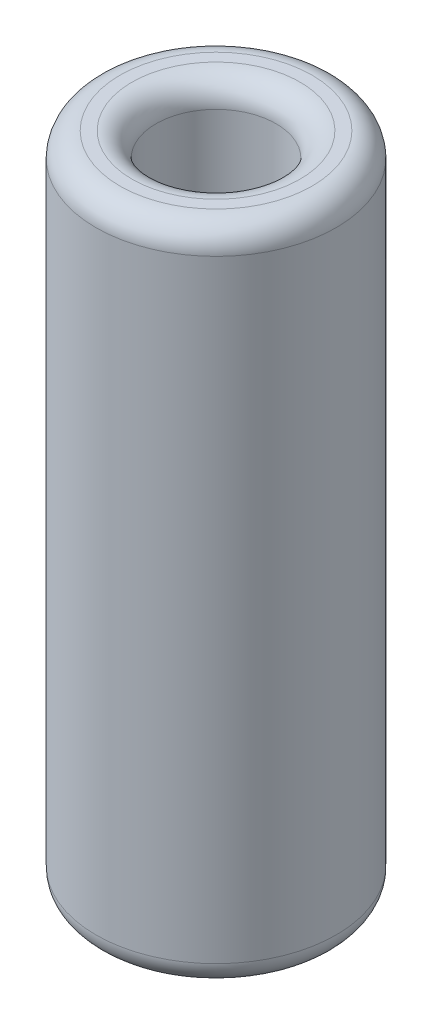
ISO-10303-21;
HEADER;
FILE_DESCRIPTION(('STEP AP214'),'2;1');
FILE_NAME('part.step','',(''),(''),'','','');
FILE_SCHEMA(('AUTOMOTIVE_DESIGN { 1 0 10303 214 1 1 1 1 }'));
ENDSEC;
DATA;
#1=APPLICATION_CONTEXT('core data for automotive mechanical design processes');
#2=APPLICATION_PROTOCOL_DEFINITION('international standard','automotive_design',2000,#1);
#3=PRODUCT_CONTEXT('',#1,'mechanical');
#4=PRODUCT('Part','Part','',(#3));
#5=PRODUCT_RELATED_PRODUCT_CATEGORY('part','',(#4));
#6=PRODUCT_DEFINITION_FORMATION('','',#4);
#7=PRODUCT_DEFINITION_CONTEXT('part definition',#1,'design');
#8=PRODUCT_DEFINITION('design','',#6,#7);
#9=PRODUCT_DEFINITION_SHAPE('','',#8);
#10=(LENGTH_UNIT() NAMED_UNIT(*) SI_UNIT(.MILLI.,.METRE.));
#11=(NAMED_UNIT(*) PLANE_ANGLE_UNIT() SI_UNIT($,.RADIAN.));
#12=(NAMED_UNIT(*) SI_UNIT($,.STERADIAN.) SOLID_ANGLE_UNIT());
#13=UNCERTAINTY_MEASURE_WITH_UNIT(LENGTH_MEASURE(1.E-05),#10,'distance_accuracy_value','');
#14=(GEOMETRIC_REPRESENTATION_CONTEXT(3) GLOBAL_UNCERTAINTY_ASSIGNED_CONTEXT((#13)) GLOBAL_UNIT_ASSIGNED_CONTEXT((#10,
#11,#12)) REPRESENTATION_CONTEXT('',''));
#15=CARTESIAN_POINT('',(0.,0.,0.));
#16=DIRECTION('',(0.,0.,1.));
#17=DIRECTION('',(1.,0.,0.));
#18=AXIS2_PLACEMENT_3D('',#15,#16,#17);
#19=CARTESIAN_POINT('',(0.,34.925,0.));
#20=DIRECTION('',(0.,1.,0.));
#21=DIRECTION('',(0.,0.,1.));
#22=AXIS2_PLACEMENT_3D('',#19,#20,#21);
#23=PLANE('',#22);
#24=CARTESIAN_POINT('',(0.,34.925,0.));
#25=DIRECTION('',(0.,1.,0.));
#26=DIRECTION('',(0.,0.,1.));
#27=AXIS2_PLACEMENT_3D('',#24,#25,#26);
#28=CIRCLE('',#27,8.89);
#29=CARTESIAN_POINT('',(0.,34.925,8.89));
#30=VERTEX_POINT('',#29);
#31=EDGE_CURVE('E10',#30,#30,#28,.F.);
#32=ORIENTED_EDGE('',*,*,#31,.T.);
#33=EDGE_LOOP('',(#32));
#34=FACE_BOUND('',#33,.T.);
#35=CARTESIAN_POINT('',(0.,34.925,0.));
#36=DIRECTION('',(0.,1.,0.));
#37=DIRECTION('',(0.,0.,1.));
#38=AXIS2_PLACEMENT_3D('',#35,#36,#37);
#39=CIRCLE('',#38,10.16);
#40=CARTESIAN_POINT('',(0.,34.925,10.16));
#41=VERTEX_POINT('',#40);
#42=EDGE_CURVE('E38',#41,#41,#39,.T.);
#43=ORIENTED_EDGE('',*,*,#42,.T.);
#44=EDGE_LOOP('',(#43));
#45=FACE_BOUND('',#44,.T.);
#46=ADVANCED_FACE('F31',(#34,#45),#23,.T.);
#47=CARTESIAN_POINT('',(0.,-34.925,0.));
#48=DIRECTION('',(0.,1.,0.));
#49=DIRECTION('',(0.,0.,1.));
#50=AXIS2_PLACEMENT_3D('',#47,#48,#49);
#51=PLANE('',#50);
#52=CARTESIAN_POINT('',(0.,-34.925,0.));
#53=DIRECTION('',(0.,1.,0.));
#54=DIRECTION('',(0.,0.,1.));
#55=AXIS2_PLACEMENT_3D('',#52,#53,#54);
#56=CIRCLE('',#55,8.89);
#57=CARTESIAN_POINT('',(0.,-34.925,8.89));
#58=VERTEX_POINT('',#57);
#59=EDGE_CURVE('E57',#58,#58,#56,.T.);
#60=ORIENTED_EDGE('',*,*,#59,.T.);
#61=EDGE_LOOP('',(#60));
#62=FACE_BOUND('',#61,.T.);
#63=CARTESIAN_POINT('',(0.,-34.925,0.));
#64=DIRECTION('',(0.,1.,0.));
#65=DIRECTION('',(0.,0.,1.));
#66=AXIS2_PLACEMENT_3D('',#63,#64,#65);
#67=CIRCLE('',#66,10.16);
#68=CARTESIAN_POINT('',(0.,-34.925,10.16));
#69=VERTEX_POINT('',#68);
#70=EDGE_CURVE('E60',#69,#69,#67,.F.);
#71=ORIENTED_EDGE('',*,*,#70,.T.);
#72=EDGE_LOOP('',(#71));
#73=FACE_BOUND('',#72,.T.);
#74=ADVANCED_FACE('F64',(#62,#73),#51,.F.);
#75=CARTESIAN_POINT('',(0.,34.925,0.));
#76=DIRECTION('',(0.,-1.,0.));
#77=DIRECTION('',(0.,0.,-1.));
#78=AXIS2_PLACEMENT_3D('',#75,#76,#77);
#79=CYLINDRICAL_SURFACE('',#78,12.7);
#80=CARTESIAN_POINT('',(0.,-32.385,0.));
#81=DIRECTION('',(0.,1.,0.));
#82=DIRECTION('',(0.,0.,1.));
#83=AXIS2_PLACEMENT_3D('',#80,#81,#82);
#84=CIRCLE('',#83,12.7);
#85=CARTESIAN_POINT('',(0.,-32.385,12.7));
#86=VERTEX_POINT('',#85);
#87=EDGE_CURVE('E42',#86,#86,#84,.T.);
#88=ORIENTED_EDGE('',*,*,#87,.T.);
#89=EDGE_LOOP('',(#88));
#90=FACE_BOUND('',#89,.T.);
#91=CARTESIAN_POINT('',(0.,32.385,0.));
#92=DIRECTION('',(0.,1.,0.));
#93=DIRECTION('',(0.,0.,1.));
#94=AXIS2_PLACEMENT_3D('',#91,#92,#93);
#95=CIRCLE('',#94,12.7);
#96=CARTESIAN_POINT('',(0.,32.385,12.7));
#97=VERTEX_POINT('',#96);
#98=EDGE_CURVE('E46',#97,#97,#95,.F.);
#99=ORIENTED_EDGE('',*,*,#98,.T.);
#100=EDGE_LOOP('',(#99));
#101=FACE_BOUND('',#100,.T.);
#102=ADVANCED_FACE('F74',(#90,#101),#79,.T.);
#103=CARTESIAN_POINT('',(0.,34.925,0.));
#104=DIRECTION('',(0.,-1.,0.));
#105=DIRECTION('',(0.,0.,-1.));
#106=AXIS2_PLACEMENT_3D('',#103,#104,#105);
#107=CYLINDRICAL_SURFACE('',#106,6.35);
#108=CARTESIAN_POINT('',(0.,-32.385,0.));
#109=DIRECTION('',(0.,1.,0.));
#110=DIRECTION('',(0.,0.,1.));
#111=AXIS2_PLACEMENT_3D('',#108,#109,#110);
#112=CIRCLE('',#111,6.35);
#113=CARTESIAN_POINT('',(0.,-32.385,6.35));
#114=VERTEX_POINT('',#113);
#115=EDGE_CURVE('E51',#114,#114,#112,.F.);
#116=ORIENTED_EDGE('',*,*,#115,.T.);
#117=EDGE_LOOP('',(#116));
#118=FACE_BOUND('',#117,.T.);
#119=CARTESIAN_POINT('',(0.,32.385,0.));
#120=DIRECTION('',(0.,1.,0.));
#121=DIRECTION('',(0.,0.,1.));
#122=AXIS2_PLACEMENT_3D('',#119,#120,#121);
#123=CIRCLE('',#122,6.35);
#124=CARTESIAN_POINT('',(0.,32.385,6.35));
#125=VERTEX_POINT('',#124);
#126=EDGE_CURVE('E54',#125,#125,#123,.T.);
#127=ORIENTED_EDGE('',*,*,#126,.T.);
#128=EDGE_LOOP('',(#127));
#129=FACE_BOUND('',#128,.T.);
#130=ADVANCED_FACE('F77',(#118,#129),#107,.F.);
#131=CARTESIAN_POINT('',(0.,-32.385,0.));
#132=DIRECTION('',(0.,1.,0.));
#133=DIRECTION('',(0.,0.,1.));
#134=AXIS2_PLACEMENT_3D('',#131,#132,#133);
#135=TOROIDAL_SURFACE('',#134,8.89,2.54);
#136=ORIENTED_EDGE('',*,*,#115,.F.);
#137=EDGE_LOOP('',(#136));
#138=FACE_BOUND('',#137,.T.);
#139=ORIENTED_EDGE('',*,*,#59,.F.);
#140=EDGE_LOOP('',(#139));
#141=FACE_BOUND('',#140,.T.);
#142=ADVANCED_FACE('F70',(#138,#141),#135,.T.);
#143=CARTESIAN_POINT('',(0.,-32.385,0.));
#144=DIRECTION('',(0.,1.,0.));
#145=DIRECTION('',(0.,0.,1.));
#146=AXIS2_PLACEMENT_3D('',#143,#144,#145);
#147=TOROIDAL_SURFACE('',#146,10.16,2.54);
#148=ORIENTED_EDGE('',*,*,#70,.F.);
#149=EDGE_LOOP('',(#148));
#150=FACE_BOUND('',#149,.T.);
#151=ORIENTED_EDGE('',*,*,#87,.F.);
#152=EDGE_LOOP('',(#151));
#153=FACE_BOUND('',#152,.T.);
#154=ADVANCED_FACE('F66',(#150,#153),#147,.T.);
#155=CARTESIAN_POINT('',(0.,32.385,0.));
#156=DIRECTION('',(0.,1.,0.));
#157=DIRECTION('',(0.,0.,1.));
#158=AXIS2_PLACEMENT_3D('',#155,#156,#157);
#159=TOROIDAL_SURFACE('',#158,8.89,2.54);
#160=ORIENTED_EDGE('',*,*,#31,.F.);
#161=EDGE_LOOP('',(#160));
#162=FACE_BOUND('',#161,.T.);
#163=ORIENTED_EDGE('',*,*,#126,.F.);
#164=EDGE_LOOP('',(#163));
#165=FACE_BOUND('',#164,.T.);
#166=ADVANCED_FACE('F69',(#162,#165),#159,.T.);
#167=CARTESIAN_POINT('',(0.,32.385,0.));
#168=DIRECTION('',(0.,1.,0.));
#169=DIRECTION('',(0.,0.,1.));
#170=AXIS2_PLACEMENT_3D('',#167,#168,#169);
#171=TOROIDAL_SURFACE('',#170,10.16,2.54);
#172=ORIENTED_EDGE('',*,*,#98,.F.);
#173=EDGE_LOOP('',(#172));
#174=FACE_BOUND('',#173,.T.);
#175=ORIENTED_EDGE('',*,*,#42,.F.);
#176=EDGE_LOOP('',(#175));
#177=FACE_BOUND('',#176,.T.);
#178=ADVANCED_FACE('F33',(#174,#177),#171,.T.);
#179=CLOSED_SHELL('',(#46,#74,#102,#130,#142,#154,#166,#178));
#180=MANIFOLD_SOLID_BREP('B2',#179);
#181=ADVANCED_BREP_SHAPE_REPRESENTATION('',(#18,#180),#14);
#182=SHAPE_DEFINITION_REPRESENTATION(#9,#181);
ENDSEC;
END-ISO-10303-21;
